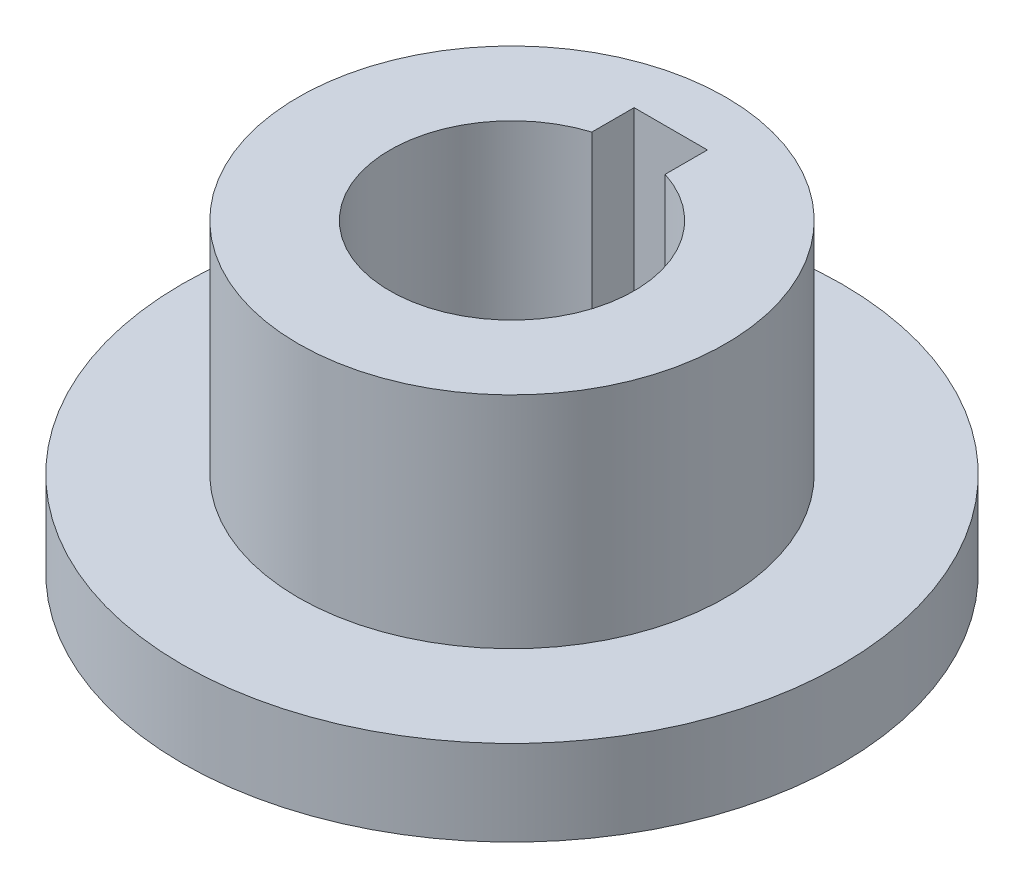
ISO-10303-21;
HEADER;
FILE_DESCRIPTION(('STEP AP214'),'2;1');
FILE_NAME('part.step','',(''),(''),'','','');
FILE_SCHEMA(('AUTOMOTIVE_DESIGN { 1 0 10303 214 1 1 1 1 }'));
ENDSEC;
DATA;
#1=APPLICATION_CONTEXT('core data for automotive mechanical design processes');
#2=APPLICATION_PROTOCOL_DEFINITION('international standard','automotive_design',2000,#1);
#3=PRODUCT_CONTEXT('',#1,'mechanical');
#4=PRODUCT('Part','Part','',(#3));
#5=PRODUCT_RELATED_PRODUCT_CATEGORY('part','',(#4));
#6=PRODUCT_DEFINITION_FORMATION('','',#4);
#7=PRODUCT_DEFINITION_CONTEXT('part definition',#1,'design');
#8=PRODUCT_DEFINITION('design','',#6,#7);
#9=PRODUCT_DEFINITION_SHAPE('','',#8);
#10=(LENGTH_UNIT() NAMED_UNIT(*) SI_UNIT(.MILLI.,.METRE.));
#11=(NAMED_UNIT(*) PLANE_ANGLE_UNIT() SI_UNIT($,.RADIAN.));
#12=(NAMED_UNIT(*) SI_UNIT($,.STERADIAN.) SOLID_ANGLE_UNIT());
#13=UNCERTAINTY_MEASURE_WITH_UNIT(LENGTH_MEASURE(1.E-05),#10,'distance_accuracy_value','');
#14=(GEOMETRIC_REPRESENTATION_CONTEXT(3) GLOBAL_UNCERTAINTY_ASSIGNED_CONTEXT((#13)) GLOBAL_UNIT_ASSIGNED_CONTEXT((#10,
#11,#12)) REPRESENTATION_CONTEXT('',''));
#15=CARTESIAN_POINT('',(0.,0.,0.));
#16=DIRECTION('',(0.,0.,1.));
#17=DIRECTION('',(1.,0.,0.));
#18=AXIS2_PLACEMENT_3D('',#15,#16,#17);
#19=CARTESIAN_POINT('',(0.,92.8571397030414,0.));
#20=DIRECTION('',(0.,1.,0.));
#21=DIRECTION('',(0.,0.,1.));
#22=AXIS2_PLACEMENT_3D('',#19,#20,#21);
#23=CYLINDRICAL_SURFACE('',#22,9.99999999999999);
#24=CARTESIAN_POINT('',(0.,0.,0.));
#25=DIRECTION('',(0.,1.,0.));
#26=DIRECTION('',(0.,0.,1.));
#27=AXIS2_PLACEMENT_3D('',#24,#25,#26);
#28=CIRCLE('',#27,9.99999999999998);
#29=CARTESIAN_POINT('',(-3.,0.,-9.53939201416944));
#30=VERTEX_POINT('',#29);
#31=CARTESIAN_POINT('',(3.,0.,-9.53939201416943));
#32=VERTEX_POINT('',#31);
#33=EDGE_CURVE('E42',#30,#32,#28,.T.);
#34=ORIENTED_EDGE('',*,*,#33,.F.);
#35=DIRECTION('',(0.,1.,0.));
#36=VECTOR('',#35,1.);
#37=CARTESIAN_POINT('',(-3.,92.8571397030414,-9.53939201416944));
#38=LINE('',#37,#36);
#39=CARTESIAN_POINT('',(-3.,25.,-9.53939201416945));
#40=VERTEX_POINT('',#39);
#41=EDGE_CURVE('E56',#30,#40,#38,.T.);
#42=ORIENTED_EDGE('',*,*,#41,.T.);
#43=CARTESIAN_POINT('',(0.,25.,0.));
#44=DIRECTION('',(0.,1.,0.));
#45=DIRECTION('',(0.,0.,1.));
#46=AXIS2_PLACEMENT_3D('',#43,#44,#45);
#47=CIRCLE('',#46,9.99999999999999);
#48=CARTESIAN_POINT('',(3.,25.,-9.53939201416945));
#49=VERTEX_POINT('',#48);
#50=EDGE_CURVE('E102',#40,#49,#47,.T.);
#51=ORIENTED_EDGE('',*,*,#50,.T.);
#52=DIRECTION('',(0.,1.,0.));
#53=VECTOR('',#52,1.);
#54=CARTESIAN_POINT('',(3.,92.8571397030414,-9.53939201416944));
#55=LINE('',#54,#53);
#56=EDGE_CURVE('E49',#49,#32,#55,.F.);
#57=ORIENTED_EDGE('',*,*,#56,.T.);
#58=EDGE_LOOP('',(#34,#42,#51,#57));
#59=FACE_BOUND('',#58,.T.);
#60=ADVANCED_FACE('F35',(#59),#23,.F.);
#61=CARTESIAN_POINT('',(9.99999999999998,0.,0.));
#62=DIRECTION('',(0.,1.,0.));
#63=DIRECTION('',(0.,0.,1.));
#64=AXIS2_PLACEMENT_3D('',#61,#62,#63);
#65=PLANE('',#64);
#66=CARTESIAN_POINT('',(0.,0.,0.));
#67=DIRECTION('',(0.,1.,0.));
#68=DIRECTION('',(0.,0.,1.));
#69=AXIS2_PLACEMENT_3D('',#66,#67,#68);
#70=CIRCLE('',#69,27.);
#71=CARTESIAN_POINT('',(0.,0.,27.));
#72=VERTEX_POINT('',#71);
#73=EDGE_CURVE('E114',#72,#72,#70,.T.);
#74=ORIENTED_EDGE('',*,*,#73,.F.);
#75=EDGE_LOOP('',(#74));
#76=FACE_BOUND('',#75,.T.);
#77=DIRECTION('',(-1.,0.,0.));
#78=VECTOR('',#77,1.);
#79=CARTESIAN_POINT('',(3.,0.,-13.));
#80=LINE('',#79,#78);
#81=CARTESIAN_POINT('',(3.,0.,-13.));
#82=VERTEX_POINT('',#81);
#83=CARTESIAN_POINT('',(-3.,0.,-13.));
#84=VERTEX_POINT('',#83);
#85=EDGE_CURVE('E82',#82,#84,#80,.T.);
#86=ORIENTED_EDGE('',*,*,#85,.T.);
#87=DIRECTION('',(0.,0.,1.));
#88=VECTOR('',#87,1.);
#89=CARTESIAN_POINT('',(-3.,0.,-4.09786388474912));
#90=LINE('',#89,#88);
#91=EDGE_CURVE('E91',#84,#30,#90,.T.);
#92=ORIENTED_EDGE('',*,*,#91,.T.);
#93=ORIENTED_EDGE('',*,*,#33,.T.);
#94=DIRECTION('',(0.,0.,-1.));
#95=VECTOR('',#94,1.);
#96=CARTESIAN_POINT('',(3.,0.,-4.09786388474912));
#97=LINE('',#96,#95);
#98=EDGE_CURVE('E77',#32,#82,#97,.T.);
#99=ORIENTED_EDGE('',*,*,#98,.T.);
#100=EDGE_LOOP('',(#86,#92,#93,#99));
#101=FACE_BOUND('',#100,.T.);
#102=ADVANCED_FACE('F89',(#76,#101),#65,.F.);
#103=CARTESIAN_POINT('',(0.,92.8571397030414,0.));
#104=DIRECTION('',(0.,1.,0.));
#105=DIRECTION('',(0.,0.,1.));
#106=AXIS2_PLACEMENT_3D('',#103,#104,#105);
#107=CYLINDRICAL_SURFACE('',#106,27.);
#108=CARTESIAN_POINT('',(0.,7.00000000000001,0.));
#109=DIRECTION('',(0.,1.,0.));
#110=DIRECTION('',(0.,0.,1.));
#111=AXIS2_PLACEMENT_3D('',#108,#109,#110);
#112=CIRCLE('',#111,27.);
#113=CARTESIAN_POINT('',(0.,7.00000000000001,27.));
#114=VERTEX_POINT('',#113);
#115=EDGE_CURVE('E111',#114,#114,#112,.T.);
#116=ORIENTED_EDGE('',*,*,#115,.F.);
#117=EDGE_LOOP('',(#116));
#118=FACE_BOUND('',#117,.T.);
#119=ORIENTED_EDGE('',*,*,#73,.T.);
#120=EDGE_LOOP('',(#119));
#121=FACE_BOUND('',#120,.T.);
#122=ADVANCED_FACE('F118',(#118,#121),#107,.T.);
#123=CARTESIAN_POINT('',(27.,7.00000000000001,0.));
#124=DIRECTION('',(0.,-1.,0.));
#125=DIRECTION('',(0.,0.,-1.));
#126=AXIS2_PLACEMENT_3D('',#123,#124,#125);
#127=PLANE('',#126);
#128=CARTESIAN_POINT('',(0.,7.00000000000001,0.));
#129=DIRECTION('',(0.,1.,0.));
#130=DIRECTION('',(0.,0.,1.));
#131=AXIS2_PLACEMENT_3D('',#128,#129,#130);
#132=CIRCLE('',#131,17.5);
#133=CARTESIAN_POINT('',(0.,7.00000000000001,17.5));
#134=VERTEX_POINT('',#133);
#135=EDGE_CURVE('E108',#134,#134,#132,.T.);
#136=ORIENTED_EDGE('',*,*,#135,.F.);
#137=EDGE_LOOP('',(#136));
#138=FACE_BOUND('',#137,.T.);
#139=ORIENTED_EDGE('',*,*,#115,.T.);
#140=EDGE_LOOP('',(#139));
#141=FACE_BOUND('',#140,.T.);
#142=ADVANCED_FACE('F125',(#138,#141),#127,.F.);
#143=CARTESIAN_POINT('',(0.,92.8571397030414,0.));
#144=DIRECTION('',(0.,1.,0.));
#145=DIRECTION('',(0.,0.,1.));
#146=AXIS2_PLACEMENT_3D('',#143,#144,#145);
#147=CYLINDRICAL_SURFACE('',#146,17.5);
#148=CARTESIAN_POINT('',(0.,25.,0.));
#149=DIRECTION('',(0.,1.,0.));
#150=DIRECTION('',(0.,0.,1.));
#151=AXIS2_PLACEMENT_3D('',#148,#149,#150);
#152=CIRCLE('',#151,17.5);
#153=CARTESIAN_POINT('',(0.,25.,17.5));
#154=VERTEX_POINT('',#153);
#155=EDGE_CURVE('E105',#154,#154,#152,.T.);
#156=ORIENTED_EDGE('',*,*,#155,.F.);
#157=EDGE_LOOP('',(#156));
#158=FACE_BOUND('',#157,.T.);
#159=ORIENTED_EDGE('',*,*,#135,.T.);
#160=EDGE_LOOP('',(#159));
#161=FACE_BOUND('',#160,.T.);
#162=ADVANCED_FACE('F132',(#158,#161),#147,.T.);
#163=CARTESIAN_POINT('',(17.5,25.,0.));
#164=DIRECTION('',(0.,-1.,0.));
#165=DIRECTION('',(0.,0.,-1.));
#166=AXIS2_PLACEMENT_3D('',#163,#164,#165);
#167=PLANE('',#166);
#168=ORIENTED_EDGE('',*,*,#50,.F.);
#169=DIRECTION('',(0.,0.,1.));
#170=VECTOR('',#169,1.);
#171=CARTESIAN_POINT('',(-3.,25.,-4.09786388474912));
#172=LINE('',#171,#170);
#173=CARTESIAN_POINT('',(-3.,25.,-13.));
#174=VERTEX_POINT('',#173);
#175=EDGE_CURVE('E96',#174,#40,#172,.T.);
#176=ORIENTED_EDGE('',*,*,#175,.F.);
#177=DIRECTION('',(-1.,0.,0.));
#178=VECTOR('',#177,1.);
#179=CARTESIAN_POINT('',(3.,25.,-13.));
#180=LINE('',#179,#178);
#181=CARTESIAN_POINT('',(3.,25.,-13.));
#182=VERTEX_POINT('',#181);
#183=EDGE_CURVE('E93',#182,#174,#180,.T.);
#184=ORIENTED_EDGE('',*,*,#183,.F.);
#185=DIRECTION('',(0.,0.,1.));
#186=VECTOR('',#185,1.);
#187=CARTESIAN_POINT('',(3.,25.,0.));
#188=LINE('',#187,#186);
#189=EDGE_CURVE('E11',#182,#49,#188,.T.);
#190=ORIENTED_EDGE('',*,*,#189,.T.);
#191=EDGE_LOOP('',(#168,#176,#184,#190));
#192=FACE_BOUND('',#191,.T.);
#193=ORIENTED_EDGE('',*,*,#155,.T.);
#194=EDGE_LOOP('',(#193));
#195=FACE_BOUND('',#194,.T.);
#196=ADVANCED_FACE('F136',(#192,#195),#167,.F.);
#197=CARTESIAN_POINT('',(-3.,0.,-4.09786388474912));
#198=DIRECTION('',(-1.,0.,0.));
#199=DIRECTION('',(0.,0.,1.));
#200=AXIS2_PLACEMENT_3D('',#197,#198,#199);
#201=PLANE('',#200);
#202=ORIENTED_EDGE('',*,*,#91,.F.);
#203=DIRECTION('',(0.,1.,0.));
#204=VECTOR('',#203,1.);
#205=CARTESIAN_POINT('',(-3.,0.,-13.));
#206=LINE('',#205,#204);
#207=EDGE_CURVE('E81',#84,#174,#206,.T.);
#208=ORIENTED_EDGE('',*,*,#207,.T.);
#209=ORIENTED_EDGE('',*,*,#175,.T.);
#210=ORIENTED_EDGE('',*,*,#41,.F.);
#211=EDGE_LOOP('',(#202,#208,#209,#210));
#212=FACE_BOUND('',#211,.T.);
#213=ADVANCED_FACE('F140',(#212),#201,.F.);
#214=CARTESIAN_POINT('',(3.,0.,-4.09786388474912));
#215=DIRECTION('',(1.,0.,0.));
#216=DIRECTION('',(0.,0.,-1.));
#217=AXIS2_PLACEMENT_3D('',#214,#215,#216);
#218=PLANE('',#217);
#219=ORIENTED_EDGE('',*,*,#189,.F.);
#220=DIRECTION('',(0.,1.,0.));
#221=VECTOR('',#220,1.);
#222=CARTESIAN_POINT('',(3.,0.,-13.));
#223=LINE('',#222,#221);
#224=EDGE_CURVE('E73',#82,#182,#223,.T.);
#225=ORIENTED_EDGE('',*,*,#224,.F.);
#226=ORIENTED_EDGE('',*,*,#98,.F.);
#227=ORIENTED_EDGE('',*,*,#56,.F.);
#228=EDGE_LOOP('',(#219,#225,#226,#227));
#229=FACE_BOUND('',#228,.T.);
#230=ADVANCED_FACE('F75',(#229),#218,.F.);
#231=CARTESIAN_POINT('',(3.,0.,-13.));
#232=DIRECTION('',(0.,0.,-1.));
#233=DIRECTION('',(-1.,0.,0.));
#234=AXIS2_PLACEMENT_3D('',#231,#232,#233);
#235=PLANE('',#234);
#236=ORIENTED_EDGE('',*,*,#183,.T.);
#237=ORIENTED_EDGE('',*,*,#207,.F.);
#238=ORIENTED_EDGE('',*,*,#85,.F.);
#239=ORIENTED_EDGE('',*,*,#224,.T.);
#240=EDGE_LOOP('',(#236,#237,#238,#239));
#241=FACE_BOUND('',#240,.T.);
#242=ADVANCED_FACE('F85',(#241),#235,.F.);
#243=CLOSED_SHELL('',(#60,#102,#122,#142,#162,#196,#213,#230,#242));
#244=MANIFOLD_SOLID_BREP('B2',#243);
#245=ADVANCED_BREP_SHAPE_REPRESENTATION('',(#18,#244),#14);
#246=SHAPE_DEFINITION_REPRESENTATION(#9,#245);
ENDSEC;
END-ISO-10303-21;
